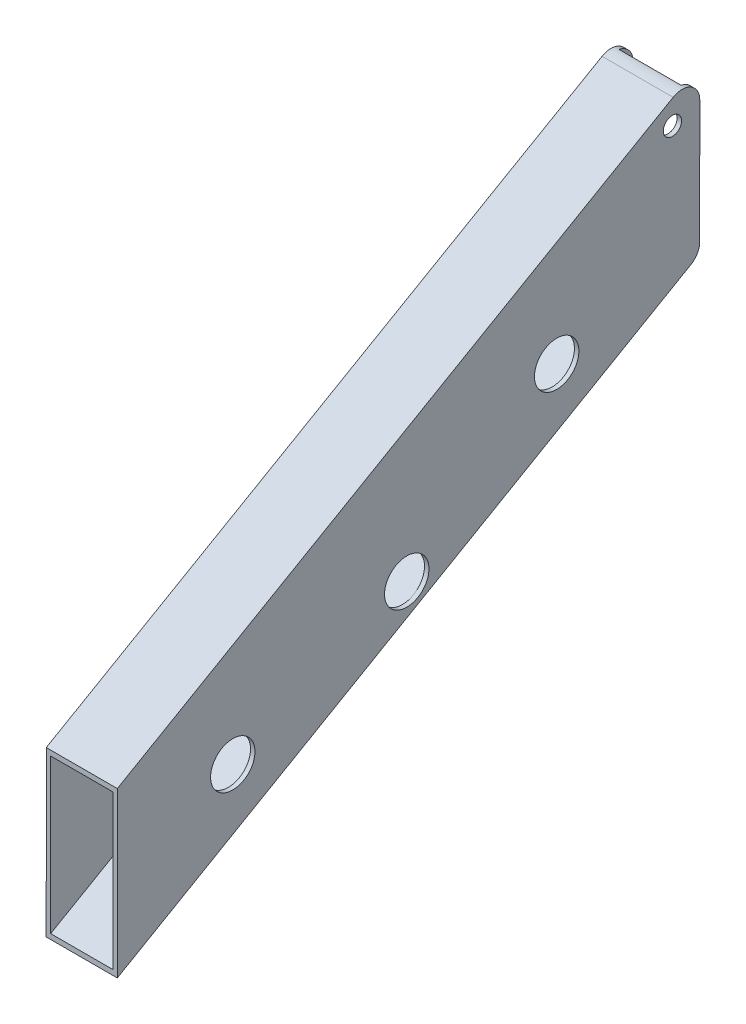
ISO-10303-21;
HEADER;
FILE_DESCRIPTION(('STEP AP214'),'2;1');
FILE_NAME('part.step','',(''),(''),'','','');
FILE_SCHEMA(('AUTOMOTIVE_DESIGN { 1 0 10303 214 1 1 1 1 }'));
ENDSEC;
DATA;
#1=APPLICATION_CONTEXT('core data for automotive mechanical design processes');
#2=APPLICATION_PROTOCOL_DEFINITION('international standard','automotive_design',2000,#1);
#3=PRODUCT_CONTEXT('',#1,'mechanical');
#4=PRODUCT('Part','Part','',(#3));
#5=PRODUCT_RELATED_PRODUCT_CATEGORY('part','',(#4));
#6=PRODUCT_DEFINITION_FORMATION('','',#4);
#7=PRODUCT_DEFINITION_CONTEXT('part definition',#1,'design');
#8=PRODUCT_DEFINITION('design','',#6,#7);
#9=PRODUCT_DEFINITION_SHAPE('','',#8);
#10=(LENGTH_UNIT() NAMED_UNIT(*) SI_UNIT(.MILLI.,.METRE.));
#11=(NAMED_UNIT(*) PLANE_ANGLE_UNIT() SI_UNIT($,.RADIAN.));
#12=(NAMED_UNIT(*) SI_UNIT($,.STERADIAN.) SOLID_ANGLE_UNIT());
#13=UNCERTAINTY_MEASURE_WITH_UNIT(LENGTH_MEASURE(1.E-05),#10,'distance_accuracy_value','');
#14=(GEOMETRIC_REPRESENTATION_CONTEXT(3) GLOBAL_UNCERTAINTY_ASSIGNED_CONTEXT((#13)) GLOBAL_UNIT_ASSIGNED_CONTEXT((#10,
#11,#12)) REPRESENTATION_CONTEXT('',''));
#15=CARTESIAN_POINT('',(0.,0.,0.));
#16=DIRECTION('',(0.,0.,1.));
#17=DIRECTION('',(1.,0.,0.));
#18=AXIS2_PLACEMENT_3D('',#15,#16,#17);
#19=CARTESIAN_POINT('',(-12.7,89.3777151476666,-104.1146));
#20=DIRECTION('',(0.,0.000211341695516609,0.999999977667344));
#21=DIRECTION('',(0.,-0.999999977667344,0.000211341695516609));
#22=AXIS2_PLACEMENT_3D('',#19,#20,#21);
#23=PLANE('',#22);
#24=DIRECTION('',(1.,0.,0.));
#25=VECTOR('',#24,1.);
#26=CARTESIAN_POINT('',(-12.7,34.3952905849226,-104.10297992091));
#27=LINE('',#26,#25);
#28=CARTESIAN_POINT('',(11.1125,34.3952905849244,-104.102979920907));
#29=VERTEX_POINT('',#28);
#30=CARTESIAN_POINT('',(12.7,34.3952905849244,-104.102979920907));
#31=VERTEX_POINT('',#30);
#32=EDGE_CURVE('E153',#29,#31,#27,.T.);
#33=ORIENTED_EDGE('',*,*,#32,.F.);
#34=DIRECTION('',(0.,-0.999999977667344,0.000211341695429688));
#35=VECTOR('',#34,1.);
#36=CARTESIAN_POINT('',(11.1125,78.3791927652278,-104.112275553569));
#37=LINE('',#36,#35);
#38=CARTESIAN_POINT('',(11.1125,78.3791927652296,-104.112275553574));
#39=VERTEX_POINT('',#38);
#40=EDGE_CURVE('E141',#39,#29,#37,.T.);
#41=ORIENTED_EDGE('',*,*,#40,.F.);
#42=DIRECTION('',(1.,0.,0.));
#43=VECTOR('',#42,1.);
#44=CARTESIAN_POINT('',(-12.7,78.3791927652278,-104.11227555358));
#45=LINE('',#44,#43);
#46=CARTESIAN_POINT('',(12.7,78.3791927652296,-104.112275553574));
#47=VERTEX_POINT('',#46);
#48=EDGE_CURVE('E158',#47,#39,#45,.F.);
#49=ORIENTED_EDGE('',*,*,#48,.F.);
#50=DIRECTION('',(0.,-0.999999977667344,0.000211341695429688));
#51=VECTOR('',#50,1.);
#52=CARTESIAN_POINT('',(12.7,78.3791927652278,-104.112275553569));
#53=LINE('',#52,#51);
#54=EDGE_CURVE('E149',#47,#31,#53,.T.);
#55=ORIENTED_EDGE('',*,*,#54,.T.);
#56=EDGE_LOOP('',(#33,#41,#49,#55));
#57=FACE_BOUND('',#56,.T.);
#58=ADVANCED_FACE('F16',(#57),#23,.F.);
#59=CARTESIAN_POINT('',(12.7,22.1742,-52.959));
#60=DIRECTION('',(-1.,0.,0.));
#61=DIRECTION('',(0.,0.,1.));
#62=AXIS2_PLACEMENT_3D('',#59,#60,#61);
#63=CYLINDRICAL_SURFACE('',#62,7.9375);
#64=CARTESIAN_POINT('',(11.1125,22.1742,-52.959));
#65=DIRECTION('',(-1.,0.,0.));
#66=DIRECTION('',(0.,0.,1.));
#67=AXIS2_PLACEMENT_3D('',#64,#65,#66);
#68=CIRCLE('',#67,7.9375);
#69=CARTESIAN_POINT('',(11.1125,22.1742,-45.0215));
#70=VERTEX_POINT('',#69);
#71=EDGE_CURVE('E135',#70,#70,#68,.F.);
#72=ORIENTED_EDGE('',*,*,#71,.F.);
#73=EDGE_LOOP('',(#72));
#74=FACE_BOUND('',#73,.T.);
#75=CARTESIAN_POINT('',(12.7,22.1742,-52.959));
#76=DIRECTION('',(-1.,0.,0.));
#77=DIRECTION('',(0.,0.,1.));
#78=AXIS2_PLACEMENT_3D('',#75,#76,#77);
#79=CIRCLE('',#78,7.9375);
#80=CARTESIAN_POINT('',(12.7,22.1742,-45.0215));
#81=VERTEX_POINT('',#80);
#82=EDGE_CURVE('E19',#81,#81,#79,.F.);
#83=ORIENTED_EDGE('',*,*,#82,.T.);
#84=EDGE_LOOP('',(#83));
#85=FACE_BOUND('',#84,.T.);
#86=ADVANCED_FACE('F386',(#74,#85),#63,.F.);
#87=CARTESIAN_POINT('',(12.7,-18.4404,0.635));
#88=DIRECTION('',(-1.,0.,0.));
#89=DIRECTION('',(0.,0.,1.));
#90=AXIS2_PLACEMENT_3D('',#87,#88,#89);
#91=CYLINDRICAL_SURFACE('',#90,7.9375);
#92=CARTESIAN_POINT('',(11.1125,-18.4404,0.635));
#93=DIRECTION('',(-1.,0.,0.));
#94=DIRECTION('',(0.,0.,1.));
#95=AXIS2_PLACEMENT_3D('',#92,#93,#94);
#96=CIRCLE('',#95,7.9375);
#97=CARTESIAN_POINT('',(11.1125,-18.4404,8.5725));
#98=VERTEX_POINT('',#97);
#99=EDGE_CURVE('E132',#98,#98,#96,.F.);
#100=ORIENTED_EDGE('',*,*,#99,.F.);
#101=EDGE_LOOP('',(#100));
#102=FACE_BOUND('',#101,.T.);
#103=CARTESIAN_POINT('',(12.7,-18.4404,0.635));
#104=DIRECTION('',(-1.,0.,0.));
#105=DIRECTION('',(0.,0.,1.));
#106=AXIS2_PLACEMENT_3D('',#103,#104,#105);
#107=CIRCLE('',#106,7.9375);
#108=CARTESIAN_POINT('',(12.7,-18.4404,8.5725));
#109=VERTEX_POINT('',#108);
#110=EDGE_CURVE('E144',#109,#109,#107,.F.);
#111=ORIENTED_EDGE('',*,*,#110,.T.);
#112=EDGE_LOOP('',(#111));
#113=FACE_BOUND('',#112,.T.);
#114=ADVANCED_FACE('F383',(#102,#113),#91,.F.);
#115=CARTESIAN_POINT('',(12.7,-43.9166,62.8396));
#116=DIRECTION('',(-1.,0.,0.));
#117=DIRECTION('',(0.,0.,1.));
#118=AXIS2_PLACEMENT_3D('',#115,#116,#117);
#119=CYLINDRICAL_SURFACE('',#118,7.9375);
#120=CARTESIAN_POINT('',(11.1125,-43.9166,62.8396));
#121=DIRECTION('',(-1.,0.,0.));
#122=DIRECTION('',(0.,0.,1.));
#123=AXIS2_PLACEMENT_3D('',#120,#121,#122);
#124=CIRCLE('',#123,7.9375);
#125=CARTESIAN_POINT('',(11.1125,-43.9166,70.7771));
#126=VERTEX_POINT('',#125);
#127=EDGE_CURVE('E129',#126,#126,#124,.F.);
#128=ORIENTED_EDGE('',*,*,#127,.F.);
#129=EDGE_LOOP('',(#128));
#130=FACE_BOUND('',#129,.T.);
#131=CARTESIAN_POINT('',(12.7,-43.9166,62.8396));
#132=DIRECTION('',(-1.,0.,0.));
#133=DIRECTION('',(0.,0.,1.));
#134=AXIS2_PLACEMENT_3D('',#131,#132,#133);
#135=CIRCLE('',#134,7.9375);
#136=CARTESIAN_POINT('',(12.7,-43.9166,70.7771));
#137=VERTEX_POINT('',#136);
#138=EDGE_CURVE('E142',#137,#137,#135,.F.);
#139=ORIENTED_EDGE('',*,*,#138,.T.);
#140=EDGE_LOOP('',(#139));
#141=FACE_BOUND('',#140,.T.);
#142=ADVANCED_FACE('F379',(#130,#141),#119,.F.);
#143=CARTESIAN_POINT('',(12.7,75.1586,-94.3356));
#144=DIRECTION('',(-1.,0.,0.));
#145=DIRECTION('',(0.,0.,1.));
#146=AXIS2_PLACEMENT_3D('',#143,#144,#145);
#147=CYLINDRICAL_SURFACE('',#146,3.2639);
#148=CARTESIAN_POINT('',(11.1125,75.1586,-94.3356));
#149=DIRECTION('',(-1.,0.,0.));
#150=DIRECTION('',(0.,0.,1.));
#151=AXIS2_PLACEMENT_3D('',#148,#149,#150);
#152=CIRCLE('',#151,3.2639);
#153=CARTESIAN_POINT('',(11.1125,75.1586,-91.0717));
#154=VERTEX_POINT('',#153);
#155=EDGE_CURVE('E126',#154,#154,#152,.F.);
#156=ORIENTED_EDGE('',*,*,#155,.F.);
#157=EDGE_LOOP('',(#156));
#158=FACE_BOUND('',#157,.T.);
#159=CARTESIAN_POINT('',(12.7,75.1586,-94.3356));
#160=DIRECTION('',(-1.,0.,0.));
#161=DIRECTION('',(0.,0.,1.));
#162=AXIS2_PLACEMENT_3D('',#159,#160,#161);
#163=CIRCLE('',#162,3.2639);
#164=CARTESIAN_POINT('',(12.7,75.1586,-91.0717));
#165=VERTEX_POINT('',#164);
#166=EDGE_CURVE('E138',#165,#165,#163,.F.);
#167=ORIENTED_EDGE('',*,*,#166,.T.);
#168=EDGE_LOOP('',(#167));
#169=FACE_BOUND('',#168,.T.);
#170=ADVANCED_FACE('F376',(#158,#169),#147,.F.);
#171=CARTESIAN_POINT('',(-12.7,32.1040995077254,-103.308745678971));
#172=DIRECTION('',(0.,0.866131055291526,0.499816961556515));
#173=DIRECTION('',(0.,-0.499816961556515,0.866131055291526));
#174=AXIS2_PLACEMENT_3D('',#171,#172,#173);
#175=PLANE('',#174);
#176=DIRECTION('',(0.,-0.499816961556501,0.866131055291535));
#177=VECTOR('',#176,1.);
#178=CARTESIAN_POINT('',(11.1125,32.3709797717286,-103.771221550081));
#179=LINE('',#178,#177);
#180=CARTESIAN_POINT('',(11.1125,32.3709797717289,-103.771221550082));
#181=VERTEX_POINT('',#180);
#182=CARTESIAN_POINT('',(11.1125,-87.6003116264853,104.126607486829));
#183=VERTEX_POINT('',#182);
#184=EDGE_CURVE('E112',#181,#183,#179,.T.);
#185=ORIENTED_EDGE('',*,*,#184,.F.);
#186=DIRECTION('',(1.,0.,0.));
#187=VECTOR('',#186,1.);
#188=CARTESIAN_POINT('',(45.81144,32.3709797717282,-103.771221550082));
#189=LINE('',#188,#187);
#190=CARTESIAN_POINT('',(-11.1125,32.3709797717289,-103.771221550082));
#191=VERTEX_POINT('',#190);
#192=EDGE_CURVE('E109',#191,#181,#189,.T.);
#193=ORIENTED_EDGE('',*,*,#192,.F.);
#194=DIRECTION('',(0.,-0.499816961556501,0.866131055291535));
#195=VECTOR('',#194,1.);
#196=CARTESIAN_POINT('',(-11.1125,32.3709797717286,-103.771221550081));
#197=LINE('',#196,#195);
#198=CARTESIAN_POINT('',(-11.1125,-87.6003116264849,104.12660748683));
#199=VERTEX_POINT('',#198);
#200=EDGE_CURVE('E92',#191,#199,#197,.T.);
#201=ORIENTED_EDGE('',*,*,#200,.T.);
#202=DIRECTION('',(1.,0.,0.));
#203=VECTOR('',#202,1.);
#204=CARTESIAN_POINT('',(-12.7,-87.6003116264838,104.126607486828));
#205=LINE('',#204,#203);
#206=EDGE_CURVE('E190',#199,#183,#205,.T.);
#207=ORIENTED_EDGE('',*,*,#206,.T.);
#208=EDGE_LOOP('',(#185,#193,#201,#207));
#209=FACE_BOUND('',#208,.T.);
#210=ADVANCED_FACE('F110',(#209),#175,.T.);
#211=CARTESIAN_POINT('',(12.7,0.,0.));
#212=DIRECTION('',(-1.,0.,0.));
#213=DIRECTION('',(0.,0.,1.));
#214=AXIS2_PLACEMENT_3D('',#211,#212,#213);
#215=PLANE('',#214);
#216=ORIENTED_EDGE('',*,*,#166,.F.);
#217=EDGE_LOOP('',(#216));
#218=FACE_BOUND('',#217,.T.);
#219=ORIENTED_EDGE('',*,*,#138,.F.);
#220=EDGE_LOOP('',(#219));
#221=FACE_BOUND('',#220,.T.);
#222=ORIENTED_EDGE('',*,*,#110,.F.);
#223=EDGE_LOOP('',(#222));
#224=FACE_BOUND('',#223,.T.);
#225=ORIENTED_EDGE('',*,*,#82,.F.);
#226=EDGE_LOOP('',(#225));
#227=FACE_BOUND('',#226,.T.);
#228=DIRECTION('',(0.,0.999999977667344,-0.000211341695515809));
#229=VECTOR('',#228,1.);
#230=CARTESIAN_POINT('',(12.7,-89.4333986902236,104.126994894565));
#231=LINE('',#230,#229);
#232=CARTESIAN_POINT('',(12.7,-30.7848,104.1146));
#233=VERTEX_POINT('',#232);
#234=CARTESIAN_POINT('',(12.7,-89.4333986902269,104.126994894563));
#235=VERTEX_POINT('',#234);
#236=EDGE_CURVE('E172',#233,#235,#231,.F.);
#237=ORIENTED_EDGE('',*,*,#236,.T.);
#238=DIRECTION('',(0.,-0.499816961556515,0.866131055291526));
#239=VECTOR('',#238,1.);
#240=CARTESIAN_POINT('',(12.7,30.729116457443,-104.102205105435));
#241=LINE('',#240,#239);
#242=CARTESIAN_POINT('',(12.7,28.8967004035883,-100.926817768607));
#243=VERTEX_POINT('',#242);
#244=EDGE_CURVE('E176',#235,#243,#241,.F.);
#245=ORIENTED_EDGE('',*,*,#244,.T.);
#246=CARTESIAN_POINT('',(12.7,34.3966326046922,-97.7529800627116));
#247=DIRECTION('',(1.,0.,0.));
#248=DIRECTION('',(0.,0.,-1.));
#249=AXIS2_PLACEMENT_3D('',#246,#247,#248);
#250=CIRCLE('',#249,6.35);
#251=EDGE_CURVE('E240',#31,#243,#250,.F.);
#252=ORIENTED_EDGE('',*,*,#251,.F.);
#253=ORIENTED_EDGE('',*,*,#54,.F.);
#254=CARTESIAN_POINT('',(12.7,78.3805347849974,-97.762275695403));
#255=DIRECTION('',(1.,0.,0.));
#256=DIRECTION('',(0.,0.,-1.));
#257=AXIS2_PLACEMENT_3D('',#254,#255,#256);
#258=CIRCLE('',#257,6.35);
#259=CARTESIAN_POINT('',(12.7,83.8804669861011,-94.5884379895075));
#260=VERTEX_POINT('',#259);
#261=EDGE_CURVE('E234',#260,#47,#258,.F.);
#262=ORIENTED_EDGE('',*,*,#261,.F.);
#263=DIRECTION('',(0.,0.499816961556515,-0.866131055291526));
#264=VECTOR('',#263,1.);
#265=CARTESIAN_POINT('',(12.7,-30.7848,104.1146));
#266=LINE('',#265,#264);
#267=EDGE_CURVE('E164',#260,#233,#266,.F.);
#268=ORIENTED_EDGE('',*,*,#267,.T.);
#269=EDGE_LOOP('',(#237,#245,#252,#253,#262,#268));
#270=FACE_BOUND('',#269,.T.);
#271=ADVANCED_FACE('F315',(#218,#221,#224,#227,#270),#215,.F.);
#272=CARTESIAN_POINT('',(11.1125,0.,0.));
#273=DIRECTION('',(-1.,0.,0.));
#274=DIRECTION('',(0.,0.,1.));
#275=AXIS2_PLACEMENT_3D('',#272,#273,#274);
#276=PLANE('',#275);
#277=ORIENTED_EDGE('',*,*,#155,.T.);
#278=EDGE_LOOP('',(#277));
#279=FACE_BOUND('',#278,.T.);
#280=ORIENTED_EDGE('',*,*,#127,.T.);
#281=EDGE_LOOP('',(#280));
#282=FACE_BOUND('',#281,.T.);
#283=ORIENTED_EDGE('',*,*,#99,.T.);
#284=EDGE_LOOP('',(#283));
#285=FACE_BOUND('',#284,.T.);
#286=ORIENTED_EDGE('',*,*,#71,.T.);
#287=EDGE_LOOP('',(#286));
#288=FACE_BOUND('',#287,.T.);
#289=DIRECTION('',(0.,0.499816961556515,-0.866131055291526));
#290=VECTOR('',#289,1.);
#291=CARTESIAN_POINT('',(11.1125,-32.1597830502824,103.321140573536));
#292=LINE('',#291,#290);
#293=CARTESIAN_POINT('',(11.1125,84.6047802536882,-99.0197606239339));
#294=VERTEX_POINT('',#293);
#295=CARTESIAN_POINT('',(11.1125,-32.6178870637402,104.114987407736));
#296=VERTEX_POINT('',#295);
#297=EDGE_CURVE('E106',#294,#296,#292,.F.);
#298=ORIENTED_EDGE('',*,*,#297,.F.);
#299=CARTESIAN_POINT('',(11.1125,78.3805347849974,-97.762275695403));
#300=DIRECTION('',(1.,0.,0.));
#301=DIRECTION('',(0.,0.,-1.));
#302=AXIS2_PLACEMENT_3D('',#299,#300,#301);
#303=CIRCLE('',#302,6.35);
#304=EDGE_CURVE('E231',#39,#294,#303,.T.);
#305=ORIENTED_EDGE('',*,*,#304,.F.);
#306=ORIENTED_EDGE('',*,*,#40,.T.);
#307=CARTESIAN_POINT('',(11.1125,34.3966326046922,-97.7529800627116));
#308=DIRECTION('',(1.,0.,0.));
#309=DIRECTION('',(0.,0.,-1.));
#310=AXIS2_PLACEMENT_3D('',#307,#308,#309);
#311=CIRCLE('',#310,6.35);
#312=EDGE_CURVE('E116',#181,#29,#311,.T.);
#313=ORIENTED_EDGE('',*,*,#312,.F.);
#314=ORIENTED_EDGE('',*,*,#184,.T.);
#315=DIRECTION('',(0.,0.999999977667344,-0.000211341695515809));
#316=VECTOR('',#315,1.);
#317=CARTESIAN_POINT('',(11.1125,-89.4333986902236,104.126994894565));
#318=LINE('',#317,#316);
#319=EDGE_CURVE('E186',#183,#296,#318,.T.);
#320=ORIENTED_EDGE('',*,*,#319,.T.);
#321=EDGE_LOOP('',(#298,#305,#306,#313,#314,#320));
#322=FACE_BOUND('',#321,.T.);
#323=ADVANCED_FACE('F244',(#279,#282,#285,#288,#322),#276,.T.);
#324=CARTESIAN_POINT('',(-12.7,-32.1597830502824,103.321140573536));
#325=DIRECTION('',(0.,-0.866131055291526,-0.499816961556515));
#326=DIRECTION('',(0.,0.499816961556515,-0.866131055291526));
#327=AXIS2_PLACEMENT_3D('',#324,#325,#326);
#328=PLANE('',#327);
#329=DIRECTION('',(0.,0.499816961556453,-0.866131055291562));
#330=VECTOR('',#329,1.);
#331=CARTESIAN_POINT('',(-11.1125,-32.6178870637398,104.114987407734));
#332=LINE('',#331,#330);
#333=CARTESIAN_POINT('',(-11.1125,-32.6178870637398,104.114987407734));
#334=VERTEX_POINT('',#333);
#335=CARTESIAN_POINT('',(-11.1125,84.6047802536858,-99.0197606239457));
#336=VERTEX_POINT('',#335);
#337=EDGE_CURVE('E105',#334,#336,#332,.T.);
#338=ORIENTED_EDGE('',*,*,#337,.T.);
#339=DIRECTION('',(1.,0.,0.));
#340=VECTOR('',#339,1.);
#341=CARTESIAN_POINT('',(45.81144,84.6047802536869,-99.0197606239403));
#342=LINE('',#341,#340);
#343=EDGE_CURVE('E230',#294,#336,#342,.F.);
#344=ORIENTED_EDGE('',*,*,#343,.F.);
#345=ORIENTED_EDGE('',*,*,#297,.T.);
#346=DIRECTION('',(1.,0.,0.));
#347=VECTOR('',#346,1.);
#348=CARTESIAN_POINT('',(-12.7,-32.6178870637398,104.114987407738));
#349=LINE('',#348,#347);
#350=EDGE_CURVE('E168',#296,#334,#349,.F.);
#351=ORIENTED_EDGE('',*,*,#350,.T.);
#352=EDGE_LOOP('',(#338,#344,#345,#351));
#353=FACE_BOUND('',#352,.T.);
#354=ADVANCED_FACE('F259',(#353),#328,.T.);
#355=CARTESIAN_POINT('',(-11.1125,0.,0.));
#356=DIRECTION('',(-1.,0.,0.));
#357=DIRECTION('',(0.,0.,1.));
#358=AXIS2_PLACEMENT_3D('',#355,#356,#357);
#359=PLANE('',#358);
#360=CARTESIAN_POINT('',(-11.1125,75.1586,-94.3356));
#361=DIRECTION('',(-1.,0.,0.));
#362=DIRECTION('',(0.,0.,1.));
#363=AXIS2_PLACEMENT_3D('',#360,#361,#362);
#364=CIRCLE('',#363,3.2639);
#365=CARTESIAN_POINT('',(-11.1125,75.1586,-91.0717));
#366=VERTEX_POINT('',#365);
#367=EDGE_CURVE('E218',#366,#366,#364,.T.);
#368=ORIENTED_EDGE('',*,*,#367,.T.);
#369=EDGE_LOOP('',(#368));
#370=FACE_BOUND('',#369,.T.);
#371=CARTESIAN_POINT('',(-11.1125,-43.9166,62.8396));
#372=DIRECTION('',(-1.,0.,0.));
#373=DIRECTION('',(0.,0.,1.));
#374=AXIS2_PLACEMENT_3D('',#371,#372,#373);
#375=CIRCLE('',#374,3.2639);
#376=CARTESIAN_POINT('',(-11.1125,-43.9166,66.1035));
#377=VERTEX_POINT('',#376);
#378=EDGE_CURVE('E221',#377,#377,#375,.T.);
#379=ORIENTED_EDGE('',*,*,#378,.T.);
#380=EDGE_LOOP('',(#379));
#381=FACE_BOUND('',#380,.T.);
#382=CARTESIAN_POINT('',(-11.1125,-18.4404,0.635));
#383=DIRECTION('',(-1.,0.,0.));
#384=DIRECTION('',(0.,0.,1.));
#385=AXIS2_PLACEMENT_3D('',#382,#383,#384);
#386=CIRCLE('',#385,3.2639);
#387=CARTESIAN_POINT('',(-11.1125,-18.4404,3.8989));
#388=VERTEX_POINT('',#387);
#389=EDGE_CURVE('E224',#388,#388,#386,.T.);
#390=ORIENTED_EDGE('',*,*,#389,.T.);
#391=EDGE_LOOP('',(#390));
#392=FACE_BOUND('',#391,.T.);
#393=CARTESIAN_POINT('',(-11.1125,22.1742,-52.959));
#394=DIRECTION('',(-1.,0.,0.));
#395=DIRECTION('',(0.,0.,1.));
#396=AXIS2_PLACEMENT_3D('',#393,#394,#395);
#397=CIRCLE('',#396,3.2639);
#398=CARTESIAN_POINT('',(-11.1125,22.1742,-49.6951));
#399=VERTEX_POINT('',#398);
#400=EDGE_CURVE('E227',#399,#399,#397,.T.);
#401=ORIENTED_EDGE('',*,*,#400,.T.);
#402=EDGE_LOOP('',(#401));
#403=FACE_BOUND('',#402,.T.);
#404=DIRECTION('',(0.,0.999999977667344,-0.000211341695515809));
#405=VECTOR('',#404,1.);
#406=CARTESIAN_POINT('',(-11.1125,-89.4333986902236,104.126994894565));
#407=LINE('',#406,#405);
#408=EDGE_CURVE('E101',#334,#199,#407,.F.);
#409=ORIENTED_EDGE('',*,*,#408,.T.);
#410=ORIENTED_EDGE('',*,*,#200,.F.);
#411=CARTESIAN_POINT('',(-11.1125,34.3966326046922,-97.7529800627116));
#412=DIRECTION('',(1.,0.,0.));
#413=DIRECTION('',(0.,0.,-1.));
#414=AXIS2_PLACEMENT_3D('',#411,#412,#413);
#415=CIRCLE('',#414,6.35);
#416=CARTESIAN_POINT('',(-11.1125,34.3952905849241,-104.102979920905));
#417=VERTEX_POINT('',#416);
#418=EDGE_CURVE('E96',#417,#191,#415,.F.);
#419=ORIENTED_EDGE('',*,*,#418,.F.);
#420=DIRECTION('',(0.,-0.999999977667344,0.000211341695516609));
#421=VECTOR('',#420,1.);
#422=CARTESIAN_POINT('',(-11.1125,89.3777151476666,-104.1146));
#423=LINE('',#422,#421);
#424=CARTESIAN_POINT('',(-11.1125,78.3791927652293,-104.112275553585));
#425=VERTEX_POINT('',#424);
#426=EDGE_CURVE('E86',#417,#425,#423,.F.);
#427=ORIENTED_EDGE('',*,*,#426,.T.);
#428=CARTESIAN_POINT('',(-11.1125,78.3805347849974,-97.762275695403));
#429=DIRECTION('',(1.,0.,0.));
#430=DIRECTION('',(0.,0.,-1.));
#431=AXIS2_PLACEMENT_3D('',#428,#429,#430);
#432=CIRCLE('',#431,6.35);
#433=EDGE_CURVE('E237',#336,#425,#432,.F.);
#434=ORIENTED_EDGE('',*,*,#433,.F.);
#435=ORIENTED_EDGE('',*,*,#337,.F.);
#436=EDGE_LOOP('',(#409,#410,#419,#427,#434,#435));
#437=FACE_BOUND('',#436,.T.);
#438=ADVANCED_FACE('F94',(#370,#381,#392,#403,#437),#359,.F.);
#439=CARTESIAN_POINT('',(-12.7,89.3777151476666,-104.1146));
#440=DIRECTION('',(0.,0.000211341695516609,0.999999977667344));
#441=DIRECTION('',(0.,-0.999999977667344,0.000211341695516609));
#442=AXIS2_PLACEMENT_3D('',#439,#440,#441);
#443=PLANE('',#442);
#444=DIRECTION('',(1.,0.,0.));
#445=VECTOR('',#444,1.);
#446=CARTESIAN_POINT('',(45.81144,34.3952905849226,-104.102979920899));
#447=LINE('',#446,#445);
#448=CARTESIAN_POINT('',(-12.7,34.3952905849244,-104.102979920901));
#449=VERTEX_POINT('',#448);
#450=EDGE_CURVE('E120',#449,#417,#447,.T.);
#451=ORIENTED_EDGE('',*,*,#450,.F.);
#452=DIRECTION('',(0.,-0.999999977667344,0.000211341695429688));
#453=VECTOR('',#452,1.);
#454=CARTESIAN_POINT('',(-12.7,78.3791927652278,-104.112275553569));
#455=LINE('',#454,#453);
#456=CARTESIAN_POINT('',(-12.7,78.3791927652296,-104.11227555358));
#457=VERTEX_POINT('',#456);
#458=EDGE_CURVE('E217',#457,#449,#455,.T.);
#459=ORIENTED_EDGE('',*,*,#458,.F.);
#460=DIRECTION('',(1.,0.,0.));
#461=VECTOR('',#460,1.);
#462=CARTESIAN_POINT('',(45.81144,78.3791927652278,-104.112275553591));
#463=LINE('',#462,#461);
#464=EDGE_CURVE('E239',#425,#457,#463,.F.);
#465=ORIENTED_EDGE('',*,*,#464,.F.);
#466=ORIENTED_EDGE('',*,*,#426,.F.);
#467=EDGE_LOOP('',(#451,#459,#465,#466));
#468=FACE_BOUND('',#467,.T.);
#469=ADVANCED_FACE('F316',(#468),#443,.F.);
#470=CARTESIAN_POINT('',(45.81144,34.3966326046922,-97.7529800627116));
#471=DIRECTION('',(1.,0.,0.));
#472=DIRECTION('',(0.,0.,-1.));
#473=AXIS2_PLACEMENT_3D('',#470,#471,#472);
#474=CYLINDRICAL_SURFACE('',#473,6.35);
#475=ORIENTED_EDGE('',*,*,#251,.T.);
#476=DIRECTION('',(1.,0.,0.));
#477=VECTOR('',#476,1.);
#478=CARTESIAN_POINT('',(-12.7,28.8967004035927,-100.926817768615));
#479=LINE('',#478,#477);
#480=CARTESIAN_POINT('',(-12.7,28.8967004035858,-100.926817768608));
#481=VERTEX_POINT('',#480);
#482=EDGE_CURVE('E181',#243,#481,#479,.F.);
#483=ORIENTED_EDGE('',*,*,#482,.T.);
#484=CARTESIAN_POINT('',(-12.7,34.3966326046922,-97.7529800627116));
#485=DIRECTION('',(1.,0.,0.));
#486=DIRECTION('',(0.,0.,-1.));
#487=AXIS2_PLACEMENT_3D('',#484,#485,#486);
#488=CIRCLE('',#487,6.35);
#489=EDGE_CURVE('E213',#449,#481,#488,.F.);
#490=ORIENTED_EDGE('',*,*,#489,.F.);
#491=ORIENTED_EDGE('',*,*,#450,.T.);
#492=ORIENTED_EDGE('',*,*,#418,.T.);
#493=ORIENTED_EDGE('',*,*,#192,.T.);
#494=ORIENTED_EDGE('',*,*,#312,.T.);
#495=ORIENTED_EDGE('',*,*,#32,.T.);
#496=EDGE_LOOP('',(#475,#483,#490,#491,#492,#493,#494,#495));
#497=FACE_BOUND('',#496,.T.);
#498=ADVANCED_FACE('F118',(#497),#474,.T.);
#499=CARTESIAN_POINT('',(-12.7,30.729116457443,-104.102205105435));
#500=DIRECTION('',(0.,0.866131055291526,0.499816961556515));
#501=DIRECTION('',(0.,-0.499816961556515,0.866131055291526));
#502=AXIS2_PLACEMENT_3D('',#499,#500,#501);
#503=PLANE('',#502);
#504=DIRECTION('',(1.,0.,0.));
#505=VECTOR('',#504,1.);
#506=CARTESIAN_POINT('',(-12.7,-89.4333986902236,104.126994894565));
#507=LINE('',#506,#505);
#508=CARTESIAN_POINT('',(-12.7,-89.4333986902236,104.126994894565));
#509=VERTEX_POINT('',#508);
#510=EDGE_CURVE('E175',#235,#509,#507,.F.);
#511=ORIENTED_EDGE('',*,*,#510,.T.);
#512=DIRECTION('',(0.,-0.499816961556453,0.866131055291562));
#513=VECTOR('',#512,1.);
#514=CARTESIAN_POINT('',(-12.7,28.896700403588,-100.926817768618));
#515=LINE('',#514,#513);
#516=EDGE_CURVE('E216',#481,#509,#515,.T.);
#517=ORIENTED_EDGE('',*,*,#516,.F.);
#518=ORIENTED_EDGE('',*,*,#482,.F.);
#519=ORIENTED_EDGE('',*,*,#244,.F.);
#520=EDGE_LOOP('',(#511,#517,#518,#519));
#521=FACE_BOUND('',#520,.T.);
#522=ADVANCED_FACE('F276',(#521),#503,.F.);
#523=CARTESIAN_POINT('',(-12.7,-89.4333986902236,104.126994894565));
#524=DIRECTION('',(0.,-0.000211341695515809,-0.999999977667344));
#525=DIRECTION('',(0.,0.999999977667344,-0.000211341695515809));
#526=AXIS2_PLACEMENT_3D('',#523,#524,#525);
#527=PLANE('',#526);
#528=ORIENTED_EDGE('',*,*,#319,.F.);
#529=ORIENTED_EDGE('',*,*,#206,.F.);
#530=ORIENTED_EDGE('',*,*,#408,.F.);
#531=ORIENTED_EDGE('',*,*,#350,.F.);
#532=EDGE_LOOP('',(#528,#529,#530,#531));
#533=FACE_BOUND('',#532,.T.);
#534=ORIENTED_EDGE('',*,*,#236,.F.);
#535=DIRECTION('',(1.,0.,0.));
#536=VECTOR('',#535,1.);
#537=CARTESIAN_POINT('',(-12.7,-30.7848,104.1146));
#538=LINE('',#537,#536);
#539=CARTESIAN_POINT('',(-12.7,-30.7848,104.1146));
#540=VERTEX_POINT('',#539);
#541=EDGE_CURVE('E167',#233,#540,#538,.F.);
#542=ORIENTED_EDGE('',*,*,#541,.T.);
#543=DIRECTION('',(0.,0.999999977667344,-0.000211341695539259));
#544=VECTOR('',#543,1.);
#545=CARTESIAN_POINT('',(-12.7,-89.4333986902236,104.126994894565));
#546=LINE('',#545,#544);
#547=EDGE_CURVE('E282',#509,#540,#546,.T.);
#548=ORIENTED_EDGE('',*,*,#547,.F.);
#549=ORIENTED_EDGE('',*,*,#510,.F.);
#550=EDGE_LOOP('',(#534,#542,#548,#549));
#551=FACE_BOUND('',#550,.T.);
#552=ADVANCED_FACE('F262',(#533,#551),#527,.F.);
#553=CARTESIAN_POINT('',(-12.7,-30.7848,104.1146));
#554=DIRECTION('',(0.,-0.866131055291526,-0.499816961556515));
#555=DIRECTION('',(0.,0.499816961556515,-0.866131055291526));
#556=AXIS2_PLACEMENT_3D('',#553,#554,#555);
#557=PLANE('',#556);
#558=ORIENTED_EDGE('',*,*,#541,.F.);
#559=ORIENTED_EDGE('',*,*,#267,.F.);
#560=DIRECTION('',(1.,0.,0.));
#561=VECTOR('',#560,1.);
#562=CARTESIAN_POINT('',(45.81144,83.8804669860898,-94.5884379895038));
#563=LINE('',#562,#561);
#564=CARTESIAN_POINT('',(-12.7,83.8804669861001,-94.5884379895081));
#565=VERTEX_POINT('',#564);
#566=EDGE_CURVE('E34',#565,#260,#563,.T.);
#567=ORIENTED_EDGE('',*,*,#566,.F.);
#568=DIRECTION('',(0.,0.499816961556506,-0.866131055291532));
#569=VECTOR('',#568,1.);
#570=CARTESIAN_POINT('',(-12.7,-30.7848,104.1146));
#571=LINE('',#570,#569);
#572=EDGE_CURVE('E212',#540,#565,#571,.T.);
#573=ORIENTED_EDGE('',*,*,#572,.F.);
#574=EDGE_LOOP('',(#558,#559,#567,#573));
#575=FACE_BOUND('',#574,.T.);
#576=ADVANCED_FACE('F317',(#575),#557,.F.);
#577=CARTESIAN_POINT('',(45.81144,78.3805347849974,-97.762275695403));
#578=DIRECTION('',(1.,0.,0.));
#579=DIRECTION('',(0.,0.,-1.));
#580=AXIS2_PLACEMENT_3D('',#577,#578,#579);
#581=CYLINDRICAL_SURFACE('',#580,6.35);
#582=ORIENTED_EDGE('',*,*,#304,.T.);
#583=ORIENTED_EDGE('',*,*,#343,.T.);
#584=ORIENTED_EDGE('',*,*,#433,.T.);
#585=ORIENTED_EDGE('',*,*,#464,.T.);
#586=CARTESIAN_POINT('',(-12.7,78.3805347849974,-97.762275695403));
#587=DIRECTION('',(1.,0.,0.));
#588=DIRECTION('',(0.,0.,-1.));
#589=AXIS2_PLACEMENT_3D('',#586,#587,#588);
#590=CIRCLE('',#589,6.35);
#591=EDGE_CURVE('E209',#565,#457,#590,.F.);
#592=ORIENTED_EDGE('',*,*,#591,.F.);
#593=ORIENTED_EDGE('',*,*,#566,.T.);
#594=ORIENTED_EDGE('',*,*,#261,.T.);
#595=ORIENTED_EDGE('',*,*,#48,.T.);
#596=EDGE_LOOP('',(#582,#583,#584,#585,#592,#593,#594,#595));
#597=FACE_BOUND('',#596,.T.);
#598=ADVANCED_FACE('F312',(#597),#581,.T.);
#599=CARTESIAN_POINT('',(12.7,22.1742,-52.959));
#600=DIRECTION('',(-1.,0.,0.));
#601=DIRECTION('',(0.,0.,1.));
#602=AXIS2_PLACEMENT_3D('',#599,#600,#601);
#603=CYLINDRICAL_SURFACE('',#602,3.2639);
#604=ORIENTED_EDGE('',*,*,#400,.F.);
#605=EDGE_LOOP('',(#604));
#606=FACE_BOUND('',#605,.T.);
#607=CARTESIAN_POINT('',(-12.7,22.1742,-52.959));
#608=DIRECTION('',(-1.,0.,0.));
#609=DIRECTION('',(0.,0.,1.));
#610=AXIS2_PLACEMENT_3D('',#607,#608,#609);
#611=CIRCLE('',#610,3.2639);
#612=CARTESIAN_POINT('',(-12.7,22.1742,-49.6951));
#613=VERTEX_POINT('',#612);
#614=EDGE_CURVE('E206',#613,#613,#611,.F.);
#615=ORIENTED_EDGE('',*,*,#614,.F.);
#616=EDGE_LOOP('',(#615));
#617=FACE_BOUND('',#616,.T.);
#618=ADVANCED_FACE('F325',(#606,#617),#603,.F.);
#619=CARTESIAN_POINT('',(12.7,-18.4404,0.635));
#620=DIRECTION('',(-1.,0.,0.));
#621=DIRECTION('',(0.,0.,1.));
#622=AXIS2_PLACEMENT_3D('',#619,#620,#621);
#623=CYLINDRICAL_SURFACE('',#622,3.2639);
#624=ORIENTED_EDGE('',*,*,#389,.F.);
#625=EDGE_LOOP('',(#624));
#626=FACE_BOUND('',#625,.T.);
#627=CARTESIAN_POINT('',(-12.7,-18.4404,0.635));
#628=DIRECTION('',(-1.,0.,0.));
#629=DIRECTION('',(0.,0.,1.));
#630=AXIS2_PLACEMENT_3D('',#627,#628,#629);
#631=CIRCLE('',#630,3.2639);
#632=CARTESIAN_POINT('',(-12.7,-18.4404,3.8989));
#633=VERTEX_POINT('',#632);
#634=EDGE_CURVE('E203',#633,#633,#631,.F.);
#635=ORIENTED_EDGE('',*,*,#634,.F.);
#636=EDGE_LOOP('',(#635));
#637=FACE_BOUND('',#636,.T.);
#638=ADVANCED_FACE('F342',(#626,#637),#623,.F.);
#639=CARTESIAN_POINT('',(12.7,-43.9166,62.8396));
#640=DIRECTION('',(-1.,0.,0.));
#641=DIRECTION('',(0.,0.,1.));
#642=AXIS2_PLACEMENT_3D('',#639,#640,#641);
#643=CYLINDRICAL_SURFACE('',#642,3.2639);
#644=ORIENTED_EDGE('',*,*,#378,.F.);
#645=EDGE_LOOP('',(#644));
#646=FACE_BOUND('',#645,.T.);
#647=CARTESIAN_POINT('',(-12.7,-43.9166,62.8396));
#648=DIRECTION('',(-1.,0.,0.));
#649=DIRECTION('',(0.,0.,1.));
#650=AXIS2_PLACEMENT_3D('',#647,#648,#649);
#651=CIRCLE('',#650,3.2639);
#652=CARTESIAN_POINT('',(-12.7,-43.9166,66.1035));
#653=VERTEX_POINT('',#652);
#654=EDGE_CURVE('E25',#653,#653,#651,.F.);
#655=ORIENTED_EDGE('',*,*,#654,.F.);
#656=EDGE_LOOP('',(#655));
#657=FACE_BOUND('',#656,.T.);
#658=ADVANCED_FACE('F335',(#646,#657),#643,.F.);
#659=CARTESIAN_POINT('',(12.7,75.1586,-94.3356));
#660=DIRECTION('',(-1.,0.,0.));
#661=DIRECTION('',(0.,0.,1.));
#662=AXIS2_PLACEMENT_3D('',#659,#660,#661);
#663=CYLINDRICAL_SURFACE('',#662,3.2639);
#664=ORIENTED_EDGE('',*,*,#367,.F.);
#665=EDGE_LOOP('',(#664));
#666=FACE_BOUND('',#665,.T.);
#667=CARTESIAN_POINT('',(-12.7,75.1586,-94.3356));
#668=DIRECTION('',(-1.,0.,0.));
#669=DIRECTION('',(0.,0.,1.));
#670=AXIS2_PLACEMENT_3D('',#667,#668,#669);
#671=CIRCLE('',#670,3.2639);
#672=CARTESIAN_POINT('',(-12.7,75.1586,-91.0717));
#673=VERTEX_POINT('',#672);
#674=EDGE_CURVE('E11',#673,#673,#671,.F.);
#675=ORIENTED_EDGE('',*,*,#674,.F.);
#676=EDGE_LOOP('',(#675));
#677=FACE_BOUND('',#676,.T.);
#678=ADVANCED_FACE('F329',(#666,#677),#663,.F.);
#679=CARTESIAN_POINT('',(-12.7,0.,0.));
#680=DIRECTION('',(-1.,0.,0.));
#681=DIRECTION('',(0.,0.,1.));
#682=AXIS2_PLACEMENT_3D('',#679,#680,#681);
#683=PLANE('',#682);
#684=ORIENTED_EDGE('',*,*,#674,.T.);
#685=EDGE_LOOP('',(#684));
#686=FACE_BOUND('',#685,.T.);
#687=ORIENTED_EDGE('',*,*,#654,.T.);
#688=EDGE_LOOP('',(#687));
#689=FACE_BOUND('',#688,.T.);
#690=ORIENTED_EDGE('',*,*,#634,.T.);
#691=EDGE_LOOP('',(#690));
#692=FACE_BOUND('',#691,.T.);
#693=ORIENTED_EDGE('',*,*,#614,.T.);
#694=EDGE_LOOP('',(#693));
#695=FACE_BOUND('',#694,.T.);
#696=ORIENTED_EDGE('',*,*,#572,.T.);
#697=ORIENTED_EDGE('',*,*,#591,.T.);
#698=ORIENTED_EDGE('',*,*,#458,.T.);
#699=ORIENTED_EDGE('',*,*,#489,.T.);
#700=ORIENTED_EDGE('',*,*,#516,.T.);
#701=ORIENTED_EDGE('',*,*,#547,.T.);
#702=EDGE_LOOP('',(#696,#697,#698,#699,#700,#701));
#703=FACE_BOUND('',#702,.T.);
#704=ADVANCED_FACE('F287',(#686,#689,#692,#695,#703),#683,.T.);
#705=CLOSED_SHELL('',(#58,#86,#114,#142,#170,#210,#271,#323,#354,#438,#469,#498,#522,#552,#576,
#598,#618,#638,#658,#678,#704));
#706=MANIFOLD_SOLID_BREP('B1',#705);
#707=ADVANCED_BREP_SHAPE_REPRESENTATION('',(#18,#706),#14);
#708=SHAPE_DEFINITION_REPRESENTATION(#9,#707);
ENDSEC;
END-ISO-10303-21;
